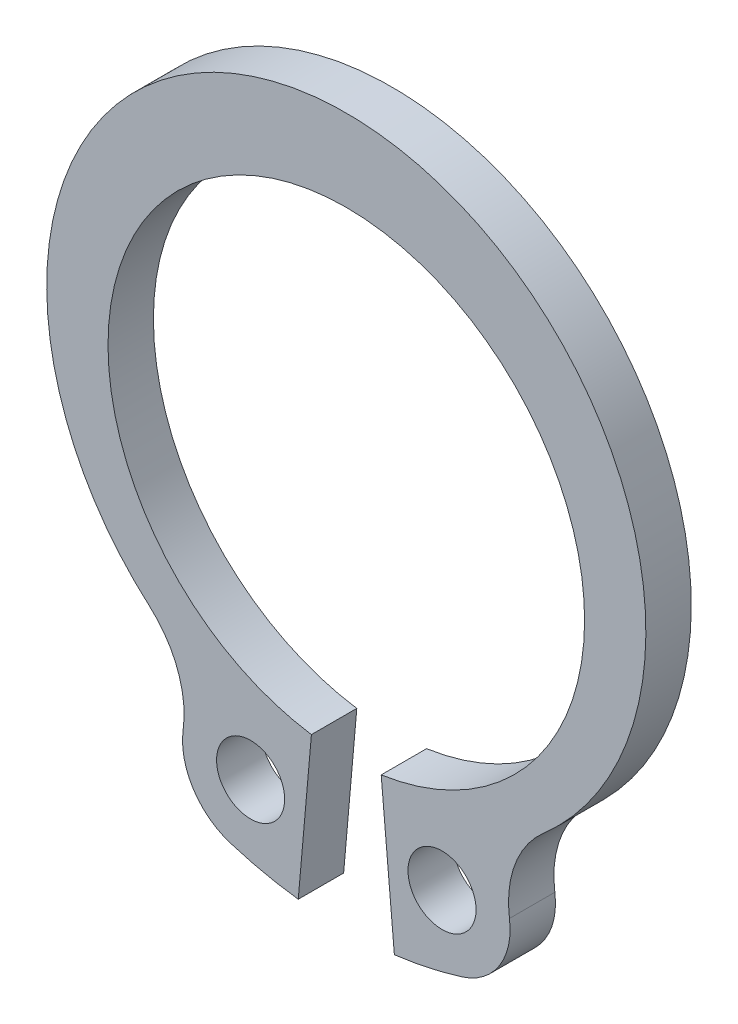
ISO-10303-21;
HEADER;
FILE_DESCRIPTION(('STEP AP214'),'2;1');
FILE_NAME('part.step','',(''),(''),'','','');
FILE_SCHEMA(('AUTOMOTIVE_DESIGN { 1 0 10303 214 1 1 1 1 }'));
ENDSEC;
DATA;
#1=APPLICATION_CONTEXT('core data for automotive mechanical design processes');
#2=APPLICATION_PROTOCOL_DEFINITION('international standard','automotive_design',2000,#1);
#3=PRODUCT_CONTEXT('',#1,'mechanical');
#4=PRODUCT('Part','Part','',(#3));
#5=PRODUCT_RELATED_PRODUCT_CATEGORY('part','',(#4));
#6=PRODUCT_DEFINITION_FORMATION('','',#4);
#7=PRODUCT_DEFINITION_CONTEXT('part definition',#1,'design');
#8=PRODUCT_DEFINITION('design','',#6,#7);
#9=PRODUCT_DEFINITION_SHAPE('','',#8);
#10=(LENGTH_UNIT() NAMED_UNIT(*) SI_UNIT(.MILLI.,.METRE.));
#11=(NAMED_UNIT(*) PLANE_ANGLE_UNIT() SI_UNIT($,.RADIAN.));
#12=(NAMED_UNIT(*) SI_UNIT($,.STERADIAN.) SOLID_ANGLE_UNIT());
#13=UNCERTAINTY_MEASURE_WITH_UNIT(LENGTH_MEASURE(1.E-05),#10,'distance_accuracy_value','');
#14=(GEOMETRIC_REPRESENTATION_CONTEXT(3) GLOBAL_UNCERTAINTY_ASSIGNED_CONTEXT((#13)) GLOBAL_UNIT_ASSIGNED_CONTEXT((#10,
#11,#12)) REPRESENTATION_CONTEXT('',''));
#15=CARTESIAN_POINT('',(0.,0.,0.));
#16=DIRECTION('',(0.,0.,1.));
#17=DIRECTION('',(1.,0.,0.));
#18=AXIS2_PLACEMENT_3D('',#15,#16,#17);
#19=CARTESIAN_POINT('',(0.,0.,1.));
#20=DIRECTION('',(0.,0.,1.));
#21=DIRECTION('',(1.,0.,0.));
#22=AXIS2_PLACEMENT_3D('',#19,#20,#21);
#23=PLANE('',#22);
#24=CARTESIAN_POINT('',(-2.108438164804,-6.72365354139164,1.));
#25=DIRECTION('',(0.,0.,1.));
#26=DIRECTION('',(-1.,0.,0.));
#27=AXIS2_PLACEMENT_3D('',#24,#25,#26);
#28=CIRCLE('',#27,0.75);
#29=CARTESIAN_POINT('',(-2.85843816480401,-6.72365354139164,1.));
#30=VERTEX_POINT('',#29);
#31=EDGE_CURVE('E130',#30,#30,#28,.T.);
#32=ORIENTED_EDGE('',*,*,#31,.F.);
#33=EDGE_LOOP('',(#32));
#34=FACE_BOUND('',#33,.T.);
#35=CARTESIAN_POINT('',(0.,0.,1.));
#36=DIRECTION('',(0.,0.,-1.));
#37=DIRECTION('',(1.,0.,0.));
#38=AXIS2_PLACEMENT_3D('',#35,#36,#37);
#39=CIRCLE('',#38,5.25);
#40=CARTESIAN_POINT('',(-0.768639364098031,-5.19342791689258,1.));
#41=VERTEX_POINT('',#40);
#42=CARTESIAN_POINT('',(0.768639364098034,-5.19342791689258,1.));
#43=VERTEX_POINT('',#42);
#44=EDGE_CURVE('E152',#41,#43,#39,.T.);
#45=ORIENTED_EDGE('',*,*,#44,.T.);
#46=DIRECTION('',(0.0879643097196943,-0.996123626973851,0.));
#47=VECTOR('',#46,1.);
#48=CARTESIAN_POINT('',(0.768639364098034,-5.19342791689258,1.));
#49=LINE('',#48,#47);
#50=CARTESIAN_POINT('',(1.05892158617303,-8.48063588590628,1.));
#51=VERTEX_POINT('',#50);
#52=EDGE_CURVE('E125',#43,#51,#49,.T.);
#53=ORIENTED_EDGE('',*,*,#52,.T.);
#54=CARTESIAN_POINT('',(0.,0.,1.));
#55=DIRECTION('',(0.,0.,1.));
#56=DIRECTION('',(1.,0.,0.));
#57=AXIS2_PLACEMENT_3D('',#54,#55,#56);
#58=CIRCLE('',#57,8.54649050517136);
#59=CARTESIAN_POINT('',(2.55726545618898,-8.15493061537418,1.));
#60=VERTEX_POINT('',#59);
#61=EDGE_CURVE('E155',#51,#60,#58,.T.);
#62=ORIENTED_EDGE('',*,*,#61,.T.);
#63=CARTESIAN_POINT('',(2.10843816480401,-6.72365354139164,1.));
#64=DIRECTION('',(0.,0.,1.));
#65=DIRECTION('',(1.,0.,0.));
#66=AXIS2_PLACEMENT_3D('',#63,#64,#65);
#67=CIRCLE('',#66,1.5);
#68=CARTESIAN_POINT('',(3.59451593907879,-6.51975933155101,1.));
#69=VERTEX_POINT('',#68);
#70=EDGE_CURVE('E157',#60,#69,#67,.T.);
#71=ORIENTED_EDGE('',*,*,#70,.T.);
#72=CARTESIAN_POINT('',(5.82363260049095,-6.21391801679007,1.));
#73=DIRECTION('',(0.,0.,-1.));
#74=DIRECTION('',(1.,0.,0.));
#75=AXIS2_PLACEMENT_3D('',#72,#73,#74);
#76=CIRCLE('',#75,2.25);
#77=CARTESIAN_POINT('',(4.3430480410441,-4.51970157184345,1.));
#78=VERTEX_POINT('',#77);
#79=EDGE_CURVE('E159',#69,#78,#76,.T.);
#80=ORIENTED_EDGE('',*,*,#79,.T.);
#81=CARTESIAN_POINT('',(0.,0.449999999999999,1.));
#82=DIRECTION('',(0.,0.,1.));
#83=DIRECTION('',(1.,0.,0.));
#84=AXIS2_PLACEMENT_3D('',#81,#82,#83);
#85=CIRCLE('',#84,6.6);
#86=CARTESIAN_POINT('',(-4.34304804104409,-4.51970157184345,1.));
#87=VERTEX_POINT('',#86);
#88=EDGE_CURVE('E161',#78,#87,#85,.T.);
#89=ORIENTED_EDGE('',*,*,#88,.T.);
#90=CARTESIAN_POINT('',(-5.82363260049094,-6.21391801679007,1.));
#91=DIRECTION('',(0.,0.,-1.));
#92=DIRECTION('',(-1.,0.,0.));
#93=AXIS2_PLACEMENT_3D('',#90,#91,#92);
#94=CIRCLE('',#93,2.25);
#95=CARTESIAN_POINT('',(-3.59451593907878,-6.51975933155102,1.));
#96=VERTEX_POINT('',#95);
#97=EDGE_CURVE('E163',#87,#96,#94,.T.);
#98=ORIENTED_EDGE('',*,*,#97,.T.);
#99=CARTESIAN_POINT('',(-2.108438164804,-6.72365354139164,1.));
#100=DIRECTION('',(0.,0.,1.));
#101=DIRECTION('',(-1.,0.,0.));
#102=AXIS2_PLACEMENT_3D('',#99,#100,#101);
#103=CIRCLE('',#102,1.5);
#104=CARTESIAN_POINT('',(-2.55726545618898,-8.15493061537418,1.));
#105=VERTEX_POINT('',#104);
#106=EDGE_CURVE('E165',#96,#105,#103,.T.);
#107=ORIENTED_EDGE('',*,*,#106,.T.);
#108=CARTESIAN_POINT('',(0.,0.,1.));
#109=DIRECTION('',(0.,0.,1.));
#110=DIRECTION('',(-1.,0.,0.));
#111=AXIS2_PLACEMENT_3D('',#108,#109,#110);
#112=CIRCLE('',#111,8.54649050517136);
#113=CARTESIAN_POINT('',(-1.05892158617302,-8.48063588590628,1.));
#114=VERTEX_POINT('',#113);
#115=EDGE_CURVE('E54',#105,#114,#112,.T.);
#116=ORIENTED_EDGE('',*,*,#115,.T.);
#117=DIRECTION('',(0.0879643097196941,0.996123626973851,0.));
#118=VECTOR('',#117,1.);
#119=CARTESIAN_POINT('',(-0.768639364098031,-5.19342791689258,1.));
#120=LINE('',#119,#118);
#121=EDGE_CURVE('E49',#114,#41,#120,.T.);
#122=ORIENTED_EDGE('',*,*,#121,.T.);
#123=EDGE_LOOP('',(#45,#53,#62,#71,#80,#89,#98,#107,#116,#122));
#124=FACE_BOUND('',#123,.T.);
#125=CARTESIAN_POINT('',(2.10843816480401,-6.72365354139164,1.));
#126=DIRECTION('',(0.,0.,1.));
#127=DIRECTION('',(1.,0.,0.));
#128=AXIS2_PLACEMENT_3D('',#125,#126,#127);
#129=CIRCLE('',#128,0.75);
#130=CARTESIAN_POINT('',(2.85843816480401,-6.72365354139164,1.));
#131=VERTEX_POINT('',#130);
#132=EDGE_CURVE('E252',#131,#131,#129,.T.);
#133=ORIENTED_EDGE('',*,*,#132,.F.);
#134=EDGE_LOOP('',(#133));
#135=FACE_BOUND('',#134,.T.);
#136=ADVANCED_FACE('F34',(#34,#124,#135),#23,.T.);
#137=CARTESIAN_POINT('',(0.,0.,0.));
#138=DIRECTION('',(0.,0.,1.));
#139=DIRECTION('',(1.,0.,0.));
#140=AXIS2_PLACEMENT_3D('',#137,#138,#139);
#141=PLANE('',#140);
#142=CARTESIAN_POINT('',(-2.108438164804,-6.72365354139164,0.));
#143=DIRECTION('',(0.,0.,1.));
#144=DIRECTION('',(-1.,0.,0.));
#145=AXIS2_PLACEMENT_3D('',#142,#143,#144);
#146=CIRCLE('',#145,0.75);
#147=CARTESIAN_POINT('',(-2.85843816480401,-6.72365354139164,0.));
#148=VERTEX_POINT('',#147);
#149=EDGE_CURVE('E133',#148,#148,#146,.T.);
#150=ORIENTED_EDGE('',*,*,#149,.T.);
#151=EDGE_LOOP('',(#150));
#152=FACE_BOUND('',#151,.T.);
#153=CARTESIAN_POINT('',(0.,0.,0.));
#154=DIRECTION('',(0.,0.,-1.));
#155=DIRECTION('',(1.,0.,0.));
#156=AXIS2_PLACEMENT_3D('',#153,#154,#155);
#157=CIRCLE('',#156,5.25);
#158=CARTESIAN_POINT('',(-0.768639364098031,-5.19342791689258,0.));
#159=VERTEX_POINT('',#158);
#160=CARTESIAN_POINT('',(0.768639364098034,-5.19342791689258,0.));
#161=VERTEX_POINT('',#160);
#162=EDGE_CURVE('E116',#159,#161,#157,.T.);
#163=ORIENTED_EDGE('',*,*,#162,.F.);
#164=DIRECTION('',(0.0879643097196941,0.996123626973851,0.));
#165=VECTOR('',#164,1.);
#166=CARTESIAN_POINT('',(-0.768639364098031,-5.19342791689258,0.));
#167=LINE('',#166,#165);
#168=CARTESIAN_POINT('',(-1.05892158617302,-8.48063588590628,0.));
#169=VERTEX_POINT('',#168);
#170=EDGE_CURVE('E150',#169,#159,#167,.T.);
#171=ORIENTED_EDGE('',*,*,#170,.F.);
#172=CARTESIAN_POINT('',(0.,0.,0.));
#173=DIRECTION('',(0.,0.,1.));
#174=DIRECTION('',(-1.,0.,0.));
#175=AXIS2_PLACEMENT_3D('',#172,#173,#174);
#176=CIRCLE('',#175,8.54649050517136);
#177=CARTESIAN_POINT('',(-2.55726545618898,-8.15493061537418,0.));
#178=VERTEX_POINT('',#177);
#179=EDGE_CURVE('E148',#178,#169,#176,.T.);
#180=ORIENTED_EDGE('',*,*,#179,.F.);
#181=CARTESIAN_POINT('',(-2.108438164804,-6.72365354139164,0.));
#182=DIRECTION('',(0.,0.,1.));
#183=DIRECTION('',(-1.,0.,0.));
#184=AXIS2_PLACEMENT_3D('',#181,#182,#183);
#185=CIRCLE('',#184,1.5);
#186=CARTESIAN_POINT('',(-3.59451593907878,-6.51975933155102,0.));
#187=VERTEX_POINT('',#186);
#188=EDGE_CURVE('E146',#187,#178,#185,.T.);
#189=ORIENTED_EDGE('',*,*,#188,.F.);
#190=CARTESIAN_POINT('',(-5.82363260049094,-6.21391801679007,0.));
#191=DIRECTION('',(0.,0.,-1.));
#192=DIRECTION('',(-1.,0.,0.));
#193=AXIS2_PLACEMENT_3D('',#190,#191,#192);
#194=CIRCLE('',#193,2.25);
#195=CARTESIAN_POINT('',(-4.34304804104409,-4.51970157184345,0.));
#196=VERTEX_POINT('',#195);
#197=EDGE_CURVE('E144',#196,#187,#194,.T.);
#198=ORIENTED_EDGE('',*,*,#197,.F.);
#199=CARTESIAN_POINT('',(0.,0.449999999999999,0.));
#200=DIRECTION('',(0.,0.,1.));
#201=DIRECTION('',(1.,0.,0.));
#202=AXIS2_PLACEMENT_3D('',#199,#200,#201);
#203=CIRCLE('',#202,6.6);
#204=CARTESIAN_POINT('',(4.3430480410441,-4.51970157184345,0.));
#205=VERTEX_POINT('',#204);
#206=EDGE_CURVE('E142',#205,#196,#203,.T.);
#207=ORIENTED_EDGE('',*,*,#206,.F.);
#208=CARTESIAN_POINT('',(5.82363260049095,-6.21391801679007,0.));
#209=DIRECTION('',(0.,0.,-1.));
#210=DIRECTION('',(1.,0.,0.));
#211=AXIS2_PLACEMENT_3D('',#208,#209,#210);
#212=CIRCLE('',#211,2.25);
#213=CARTESIAN_POINT('',(3.59451593907879,-6.51975933155101,0.));
#214=VERTEX_POINT('',#213);
#215=EDGE_CURVE('E140',#214,#205,#212,.T.);
#216=ORIENTED_EDGE('',*,*,#215,.F.);
#217=CARTESIAN_POINT('',(2.10843816480401,-6.72365354139164,0.));
#218=DIRECTION('',(0.,0.,1.));
#219=DIRECTION('',(1.,0.,0.));
#220=AXIS2_PLACEMENT_3D('',#217,#218,#219);
#221=CIRCLE('',#220,1.5);
#222=CARTESIAN_POINT('',(2.55726545618898,-8.15493061537418,0.));
#223=VERTEX_POINT('',#222);
#224=EDGE_CURVE('E138',#223,#214,#221,.T.);
#225=ORIENTED_EDGE('',*,*,#224,.F.);
#226=CARTESIAN_POINT('',(0.,0.,0.));
#227=DIRECTION('',(0.,0.,1.));
#228=DIRECTION('',(1.,0.,0.));
#229=AXIS2_PLACEMENT_3D('',#226,#227,#228);
#230=CIRCLE('',#229,8.54649050517136);
#231=CARTESIAN_POINT('',(1.05892158617303,-8.48063588590628,0.));
#232=VERTEX_POINT('',#231);
#233=EDGE_CURVE('E118',#232,#223,#230,.T.);
#234=ORIENTED_EDGE('',*,*,#233,.F.);
#235=DIRECTION('',(0.0879643097196943,-0.996123626973851,0.));
#236=VECTOR('',#235,1.);
#237=CARTESIAN_POINT('',(0.768639364098034,-5.19342791689258,0.));
#238=LINE('',#237,#236);
#239=EDGE_CURVE('E111',#161,#232,#238,.T.);
#240=ORIENTED_EDGE('',*,*,#239,.F.);
#241=EDGE_LOOP('',(#163,#171,#180,#189,#198,#207,#216,#225,#234,#240));
#242=FACE_BOUND('',#241,.T.);
#243=CARTESIAN_POINT('',(2.10843816480401,-6.72365354139164,0.));
#244=DIRECTION('',(0.,0.,1.));
#245=DIRECTION('',(1.,0.,0.));
#246=AXIS2_PLACEMENT_3D('',#243,#244,#245);
#247=CIRCLE('',#246,0.75);
#248=CARTESIAN_POINT('',(2.85843816480401,-6.72365354139164,0.));
#249=VERTEX_POINT('',#248);
#250=EDGE_CURVE('E255',#249,#249,#247,.T.);
#251=ORIENTED_EDGE('',*,*,#250,.T.);
#252=EDGE_LOOP('',(#251));
#253=FACE_BOUND('',#252,.T.);
#254=ADVANCED_FACE('F112',(#152,#242,#253),#141,.F.);
#255=CARTESIAN_POINT('',(0.,0.,1.));
#256=DIRECTION('',(0.,0.,-1.));
#257=DIRECTION('',(-1.,0.,0.));
#258=AXIS2_PLACEMENT_3D('',#255,#256,#257);
#259=CYLINDRICAL_SURFACE('',#258,5.25);
#260=ORIENTED_EDGE('',*,*,#162,.T.);
#261=DIRECTION('',(0.,0.,-1.));
#262=VECTOR('',#261,1.);
#263=CARTESIAN_POINT('',(0.768639364098034,-5.19342791689258,1.));
#264=LINE('',#263,#262);
#265=EDGE_CURVE('E11',#43,#161,#264,.T.);
#266=ORIENTED_EDGE('',*,*,#265,.F.);
#267=ORIENTED_EDGE('',*,*,#44,.F.);
#268=DIRECTION('',(0.,0.,-1.));
#269=VECTOR('',#268,1.);
#270=CARTESIAN_POINT('',(-0.768639364098031,-5.19342791689258,1.));
#271=LINE('',#270,#269);
#272=EDGE_CURVE('E129',#41,#159,#271,.T.);
#273=ORIENTED_EDGE('',*,*,#272,.T.);
#274=EDGE_LOOP('',(#260,#266,#267,#273));
#275=FACE_BOUND('',#274,.T.);
#276=ADVANCED_FACE('F36',(#275),#259,.F.);
#277=CARTESIAN_POINT('',(0.768639364098034,-5.19342791689258,1.));
#278=DIRECTION('',(0.996123626973851,0.0879643097196943,0.));
#279=DIRECTION('',(-0.0879643097196943,0.996123626973851,0.));
#280=AXIS2_PLACEMENT_3D('',#277,#278,#279);
#281=PLANE('',#280);
#282=ORIENTED_EDGE('',*,*,#239,.T.);
#283=DIRECTION('',(0.,0.,-1.));
#284=VECTOR('',#283,1.);
#285=CARTESIAN_POINT('',(1.05892158617303,-8.48063588590628,1.));
#286=LINE('',#285,#284);
#287=EDGE_CURVE('E42',#51,#232,#286,.T.);
#288=ORIENTED_EDGE('',*,*,#287,.F.);
#289=ORIENTED_EDGE('',*,*,#52,.F.);
#290=ORIENTED_EDGE('',*,*,#265,.T.);
#291=EDGE_LOOP('',(#282,#288,#289,#290));
#292=FACE_BOUND('',#291,.T.);
#293=ADVANCED_FACE('F124',(#292),#281,.F.);
#294=CARTESIAN_POINT('',(0.,0.,1.));
#295=DIRECTION('',(0.,0.,-1.));
#296=DIRECTION('',(-1.,0.,0.));
#297=AXIS2_PLACEMENT_3D('',#294,#295,#296);
#298=CYLINDRICAL_SURFACE('',#297,8.54649050517136);
#299=ORIENTED_EDGE('',*,*,#233,.T.);
#300=DIRECTION('',(0.,0.,-1.));
#301=VECTOR('',#300,1.);
#302=CARTESIAN_POINT('',(2.55726545618898,-8.15493061537418,1.));
#303=LINE('',#302,#301);
#304=EDGE_CURVE('E188',#60,#223,#303,.T.);
#305=ORIENTED_EDGE('',*,*,#304,.F.);
#306=ORIENTED_EDGE('',*,*,#61,.F.);
#307=ORIENTED_EDGE('',*,*,#287,.T.);
#308=EDGE_LOOP('',(#299,#305,#306,#307));
#309=FACE_BOUND('',#308,.T.);
#310=ADVANCED_FACE('F192',(#309),#298,.T.);
#311=CARTESIAN_POINT('',(2.10843816480401,-6.72365354139164,1.));
#312=DIRECTION('',(0.,0.,-1.));
#313=DIRECTION('',(-1.,0.,0.));
#314=AXIS2_PLACEMENT_3D('',#311,#312,#313);
#315=CYLINDRICAL_SURFACE('',#314,1.5);
#316=ORIENTED_EDGE('',*,*,#224,.T.);
#317=DIRECTION('',(0.,0.,-1.));
#318=VECTOR('',#317,1.);
#319=CARTESIAN_POINT('',(3.59451593907879,-6.51975933155101,1.));
#320=LINE('',#319,#318);
#321=EDGE_CURVE('E185',#69,#214,#320,.T.);
#322=ORIENTED_EDGE('',*,*,#321,.F.);
#323=ORIENTED_EDGE('',*,*,#70,.F.);
#324=ORIENTED_EDGE('',*,*,#304,.T.);
#325=EDGE_LOOP('',(#316,#322,#323,#324));
#326=FACE_BOUND('',#325,.T.);
#327=ADVANCED_FACE('F200',(#326),#315,.T.);
#328=CARTESIAN_POINT('',(5.82363260049095,-6.21391801679007,1.));
#329=DIRECTION('',(0.,0.,-1.));
#330=DIRECTION('',(-1.,0.,0.));
#331=AXIS2_PLACEMENT_3D('',#328,#329,#330);
#332=CYLINDRICAL_SURFACE('',#331,2.25);
#333=ORIENTED_EDGE('',*,*,#215,.T.);
#334=DIRECTION('',(0.,0.,-1.));
#335=VECTOR('',#334,1.);
#336=CARTESIAN_POINT('',(4.3430480410441,-4.51970157184345,1.));
#337=LINE('',#336,#335);
#338=EDGE_CURVE('E182',#78,#205,#337,.T.);
#339=ORIENTED_EDGE('',*,*,#338,.F.);
#340=ORIENTED_EDGE('',*,*,#79,.F.);
#341=ORIENTED_EDGE('',*,*,#321,.T.);
#342=EDGE_LOOP('',(#333,#339,#340,#341));
#343=FACE_BOUND('',#342,.T.);
#344=ADVANCED_FACE('F203',(#343),#332,.F.);
#345=CARTESIAN_POINT('',(0.,0.449999999999999,1.));
#346=DIRECTION('',(0.,0.,-1.));
#347=DIRECTION('',(-1.,0.,0.));
#348=AXIS2_PLACEMENT_3D('',#345,#346,#347);
#349=CYLINDRICAL_SURFACE('',#348,6.6);
#350=ORIENTED_EDGE('',*,*,#206,.T.);
#351=DIRECTION('',(0.,0.,-1.));
#352=VECTOR('',#351,1.);
#353=CARTESIAN_POINT('',(-4.34304804104409,-4.51970157184345,1.));
#354=LINE('',#353,#352);
#355=EDGE_CURVE('E179',#87,#196,#354,.T.);
#356=ORIENTED_EDGE('',*,*,#355,.F.);
#357=ORIENTED_EDGE('',*,*,#88,.F.);
#358=ORIENTED_EDGE('',*,*,#338,.T.);
#359=EDGE_LOOP('',(#350,#356,#357,#358));
#360=FACE_BOUND('',#359,.T.);
#361=ADVANCED_FACE('F208',(#360),#349,.T.);
#362=CARTESIAN_POINT('',(-5.82363260049094,-6.21391801679007,1.));
#363=DIRECTION('',(0.,0.,-1.));
#364=DIRECTION('',(-1.,0.,0.));
#365=AXIS2_PLACEMENT_3D('',#362,#363,#364);
#366=CYLINDRICAL_SURFACE('',#365,2.25);
#367=ORIENTED_EDGE('',*,*,#197,.T.);
#368=DIRECTION('',(0.,0.,-1.));
#369=VECTOR('',#368,1.);
#370=CARTESIAN_POINT('',(-3.59451593907878,-6.51975933155102,1.));
#371=LINE('',#370,#369);
#372=EDGE_CURVE('E176',#96,#187,#371,.T.);
#373=ORIENTED_EDGE('',*,*,#372,.F.);
#374=ORIENTED_EDGE('',*,*,#97,.F.);
#375=ORIENTED_EDGE('',*,*,#355,.T.);
#376=EDGE_LOOP('',(#367,#373,#374,#375));
#377=FACE_BOUND('',#376,.T.);
#378=ADVANCED_FACE('F214',(#377),#366,.F.);
#379=CARTESIAN_POINT('',(-2.108438164804,-6.72365354139164,1.));
#380=DIRECTION('',(0.,0.,-1.));
#381=DIRECTION('',(-1.,0.,0.));
#382=AXIS2_PLACEMENT_3D('',#379,#380,#381);
#383=CYLINDRICAL_SURFACE('',#382,1.5);
#384=ORIENTED_EDGE('',*,*,#188,.T.);
#385=DIRECTION('',(0.,0.,-1.));
#386=VECTOR('',#385,1.);
#387=CARTESIAN_POINT('',(-2.55726545618898,-8.15493061537418,1.));
#388=LINE('',#387,#386);
#389=EDGE_CURVE('E173',#105,#178,#388,.T.);
#390=ORIENTED_EDGE('',*,*,#389,.F.);
#391=ORIENTED_EDGE('',*,*,#106,.F.);
#392=ORIENTED_EDGE('',*,*,#372,.T.);
#393=EDGE_LOOP('',(#384,#390,#391,#392));
#394=FACE_BOUND('',#393,.T.);
#395=ADVANCED_FACE('F218',(#394),#383,.T.);
#396=CARTESIAN_POINT('',(0.,0.,1.));
#397=DIRECTION('',(0.,0.,-1.));
#398=DIRECTION('',(-1.,0.,0.));
#399=AXIS2_PLACEMENT_3D('',#396,#397,#398);
#400=CYLINDRICAL_SURFACE('',#399,8.54649050517136);
#401=ORIENTED_EDGE('',*,*,#179,.T.);
#402=DIRECTION('',(0.,0.,-1.));
#403=VECTOR('',#402,1.);
#404=CARTESIAN_POINT('',(-1.05892158617302,-8.48063588590628,1.));
#405=LINE('',#404,#403);
#406=EDGE_CURVE('E170',#114,#169,#405,.T.);
#407=ORIENTED_EDGE('',*,*,#406,.F.);
#408=ORIENTED_EDGE('',*,*,#115,.F.);
#409=ORIENTED_EDGE('',*,*,#389,.T.);
#410=EDGE_LOOP('',(#401,#407,#408,#409));
#411=FACE_BOUND('',#410,.T.);
#412=ADVANCED_FACE('F221',(#411),#400,.T.);
#413=CARTESIAN_POINT('',(-0.768639364098031,-5.19342791689258,1.));
#414=DIRECTION('',(-0.996123626973851,0.0879643097196941,0.));
#415=DIRECTION('',(-0.0879643097196941,-0.996123626973851,0.));
#416=AXIS2_PLACEMENT_3D('',#413,#414,#415);
#417=PLANE('',#416);
#418=ORIENTED_EDGE('',*,*,#170,.T.);
#419=ORIENTED_EDGE('',*,*,#272,.F.);
#420=ORIENTED_EDGE('',*,*,#121,.F.);
#421=ORIENTED_EDGE('',*,*,#406,.T.);
#422=EDGE_LOOP('',(#418,#419,#420,#421));
#423=FACE_BOUND('',#422,.T.);
#424=ADVANCED_FACE('F223',(#423),#417,.F.);
#425=CARTESIAN_POINT('',(-2.108438164804,-6.72365354139164,1.));
#426=DIRECTION('',(0.,0.,-1.));
#427=DIRECTION('',(-1.,0.,0.));
#428=AXIS2_PLACEMENT_3D('',#425,#426,#427);
#429=CYLINDRICAL_SURFACE('',#428,0.75);
#430=ORIENTED_EDGE('',*,*,#31,.T.);
#431=EDGE_LOOP('',(#430));
#432=FACE_BOUND('',#431,.T.);
#433=ORIENTED_EDGE('',*,*,#149,.F.);
#434=EDGE_LOOP('',(#433));
#435=FACE_BOUND('',#434,.T.);
#436=ADVANCED_FACE('F225',(#432,#435),#429,.F.);
#437=CARTESIAN_POINT('',(2.10843816480401,-6.72365354139164,1.));
#438=DIRECTION('',(0.,0.,-1.));
#439=DIRECTION('',(-1.,0.,0.));
#440=AXIS2_PLACEMENT_3D('',#437,#438,#439);
#441=CYLINDRICAL_SURFACE('',#440,0.75);
#442=ORIENTED_EDGE('',*,*,#132,.T.);
#443=EDGE_LOOP('',(#442));
#444=FACE_BOUND('',#443,.T.);
#445=ORIENTED_EDGE('',*,*,#250,.F.);
#446=EDGE_LOOP('',(#445));
#447=FACE_BOUND('',#446,.T.);
#448=ADVANCED_FACE('F231',(#444,#447),#441,.F.);
#449=CLOSED_SHELL('',(#136,#254,#276,#293,#310,#327,#344,#361,#378,#395,#412,#424,#436,#448));
#450=MANIFOLD_SOLID_BREP('B2',#449);
#451=ADVANCED_BREP_SHAPE_REPRESENTATION('',(#18,#450),#14);
#452=SHAPE_DEFINITION_REPRESENTATION(#9,#451);
ENDSEC;
END-ISO-10303-21;
